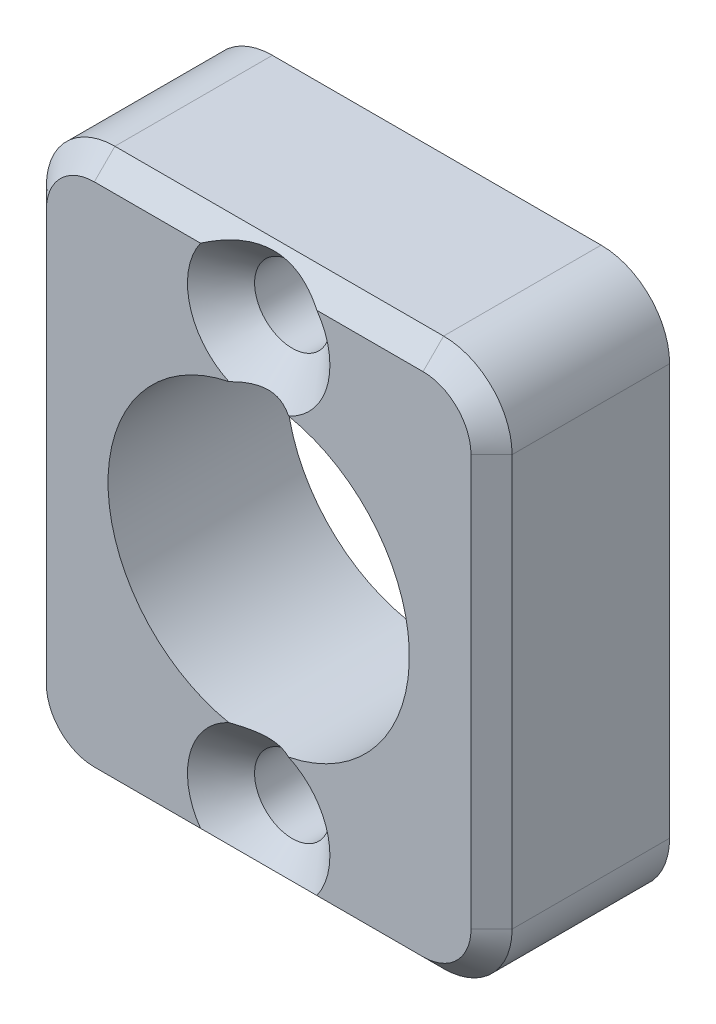
ISO-10303-21;
HEADER;
FILE_DESCRIPTION(('STEP AP214'),'2;1');
FILE_NAME('part.step','',(''),(''),'','','');
FILE_SCHEMA(('AUTOMOTIVE_DESIGN { 1 0 10303 214 1 1 1 1 }'));
ENDSEC;
DATA;
#1=APPLICATION_CONTEXT('core data for automotive mechanical design processes');
#2=APPLICATION_PROTOCOL_DEFINITION('international standard','automotive_design',2000,#1);
#3=PRODUCT_CONTEXT('',#1,'mechanical');
#4=PRODUCT('Part','Part','',(#3));
#5=PRODUCT_RELATED_PRODUCT_CATEGORY('part','',(#4));
#6=PRODUCT_DEFINITION_FORMATION('','',#4);
#7=PRODUCT_DEFINITION_CONTEXT('part definition',#1,'design');
#8=PRODUCT_DEFINITION('design','',#6,#7);
#9=PRODUCT_DEFINITION_SHAPE('','',#8);
#10=(LENGTH_UNIT() NAMED_UNIT(*) SI_UNIT(.MILLI.,.METRE.));
#11=(NAMED_UNIT(*) PLANE_ANGLE_UNIT() SI_UNIT($,.RADIAN.));
#12=(NAMED_UNIT(*) SI_UNIT($,.STERADIAN.) SOLID_ANGLE_UNIT());
#13=UNCERTAINTY_MEASURE_WITH_UNIT(LENGTH_MEASURE(1.E-05),#10,'distance_accuracy_value','');
#14=(GEOMETRIC_REPRESENTATION_CONTEXT(3) GLOBAL_UNCERTAINTY_ASSIGNED_CONTEXT((#13)) GLOBAL_UNIT_ASSIGNED_CONTEXT((#10,
#11,#12)) REPRESENTATION_CONTEXT('',''));
#15=CARTESIAN_POINT('',(0.,0.,0.));
#16=DIRECTION('',(0.,0.,1.));
#17=DIRECTION('',(1.,0.,0.));
#18=AXIS2_PLACEMENT_3D('',#15,#16,#17);
#19=CARTESIAN_POINT('',(0.,0.,0.));
#20=DIRECTION('',(0.,0.,1.));
#21=DIRECTION('',(1.,0.,0.));
#22=AXIS2_PLACEMENT_3D('',#19,#20,#21);
#23=PLANE('',#22);
#24=CARTESIAN_POINT('',(0.,15.5,0.));
#25=DIRECTION('',(0.,0.,1.));
#26=DIRECTION('',(1.,0.,0.));
#27=AXIS2_PLACEMENT_3D('',#24,#25,#26);
#28=CIRCLE('',#27,5.2);
#29=CARTESIAN_POINT('',(-4.24735211631906,18.5,0.));
#30=VERTEX_POINT('',#29);
#31=CARTESIAN_POINT('',(-2.1842011233736,10.7809677419355,0.));
#32=VERTEX_POINT('',#31);
#33=EDGE_CURVE('E159',#30,#32,#28,.T.);
#34=ORIENTED_EDGE('',*,*,#33,.F.);
#35=DIRECTION('',(-1.,0.,0.));
#36=VECTOR('',#35,1.);
#37=CARTESIAN_POINT('',(0.,18.5,0.));
#38=LINE('',#37,#36);
#39=CARTESIAN_POINT('',(-12.,18.5,0.));
#40=VERTEX_POINT('',#39);
#41=EDGE_CURVE('E397',#30,#40,#38,.T.);
#42=ORIENTED_EDGE('',*,*,#41,.T.);
#43=CARTESIAN_POINT('',(-12.,15.,0.));
#44=DIRECTION('',(0.,0.,1.));
#45=DIRECTION('',(1.,0.,0.));
#46=AXIS2_PLACEMENT_3D('',#43,#44,#45);
#47=CIRCLE('',#46,3.5);
#48=CARTESIAN_POINT('',(-15.5,15.,0.));
#49=VERTEX_POINT('',#48);
#50=EDGE_CURVE('E401',#40,#49,#47,.T.);
#51=ORIENTED_EDGE('',*,*,#50,.T.);
#52=DIRECTION('',(0.,-1.,0.));
#53=VECTOR('',#52,1.);
#54=CARTESIAN_POINT('',(-15.5,0.,0.));
#55=LINE('',#54,#53);
#56=CARTESIAN_POINT('',(-15.5,-15.,0.));
#57=VERTEX_POINT('',#56);
#58=EDGE_CURVE('E431',#49,#57,#55,.T.);
#59=ORIENTED_EDGE('',*,*,#58,.T.);
#60=CARTESIAN_POINT('',(-12.,-15.,0.));
#61=DIRECTION('',(0.,0.,1.));
#62=DIRECTION('',(1.,0.,0.));
#63=AXIS2_PLACEMENT_3D('',#60,#61,#62);
#64=CIRCLE('',#63,3.5);
#65=CARTESIAN_POINT('',(-12.,-18.5,0.));
#66=VERTEX_POINT('',#65);
#67=EDGE_CURVE('E398',#57,#66,#64,.T.);
#68=ORIENTED_EDGE('',*,*,#67,.T.);
#69=DIRECTION('',(1.,0.,0.));
#70=VECTOR('',#69,1.);
#71=CARTESIAN_POINT('',(0.,-18.5,0.));
#72=LINE('',#71,#70);
#73=CARTESIAN_POINT('',(-4.24735211631906,-18.5,0.));
#74=VERTEX_POINT('',#73);
#75=EDGE_CURVE('E396',#66,#74,#72,.T.);
#76=ORIENTED_EDGE('',*,*,#75,.T.);
#77=CARTESIAN_POINT('',(0.,-15.5,0.));
#78=DIRECTION('',(0.,0.,1.));
#79=DIRECTION('',(1.,0.,0.));
#80=AXIS2_PLACEMENT_3D('',#77,#78,#79);
#81=CIRCLE('',#80,5.2);
#82=CARTESIAN_POINT('',(-2.18420112337361,-10.7809677419355,0.));
#83=VERTEX_POINT('',#82);
#84=EDGE_CURVE('E387',#83,#74,#81,.T.);
#85=ORIENTED_EDGE('',*,*,#84,.F.);
#86=CARTESIAN_POINT('',(0.,0.,0.));
#87=DIRECTION('',(0.,0.,1.));
#88=DIRECTION('',(1.,0.,0.));
#89=AXIS2_PLACEMENT_3D('',#86,#87,#88);
#90=CIRCLE('',#89,11.);
#91=EDGE_CURVE('E180',#32,#83,#90,.T.);
#92=ORIENTED_EDGE('',*,*,#91,.F.);
#93=EDGE_LOOP('',(#34,#42,#51,#59,#68,#76,#85,#92));
#94=FACE_BOUND('',#93,.T.);
#95=ADVANCED_FACE('F37',(#94),#23,.T.);
#96=CARTESIAN_POINT('',(17.,20.,-13.));
#97=DIRECTION('',(1.,0.,0.));
#98=DIRECTION('',(0.,1.,0.));
#99=AXIS2_PLACEMENT_3D('',#96,#97,#98);
#100=PLANE('',#99);
#101=DIRECTION('',(0.,0.,1.));
#102=VECTOR('',#101,1.);
#103=CARTESIAN_POINT('',(17.,15.,-13.));
#104=LINE('',#103,#102);
#105=CARTESIAN_POINT('',(17.,15.,-13.));
#106=VERTEX_POINT('',#105);
#107=CARTESIAN_POINT('',(17.,15.,-1.50000000000001));
#108=VERTEX_POINT('',#107);
#109=EDGE_CURVE('E315',#106,#108,#104,.T.);
#110=ORIENTED_EDGE('',*,*,#109,.T.);
#111=DIRECTION('',(0.,-1.,0.));
#112=VECTOR('',#111,1.);
#113=CARTESIAN_POINT('',(17.,20.,-1.50000000000001));
#114=LINE('',#113,#112);
#115=CARTESIAN_POINT('',(17.,-15.,-1.50000000000001));
#116=VERTEX_POINT('',#115);
#117=EDGE_CURVE('E355',#108,#116,#114,.T.);
#118=ORIENTED_EDGE('',*,*,#117,.T.);
#119=DIRECTION('',(0.,0.,1.));
#120=VECTOR('',#119,1.);
#121=CARTESIAN_POINT('',(17.,-15.,-13.));
#122=LINE('',#121,#120);
#123=CARTESIAN_POINT('',(17.,-15.,-13.));
#124=VERTEX_POINT('',#123);
#125=EDGE_CURVE('E318',#116,#124,#122,.F.);
#126=ORIENTED_EDGE('',*,*,#125,.T.);
#127=DIRECTION('',(0.,1.,0.));
#128=VECTOR('',#127,1.);
#129=CARTESIAN_POINT('',(17.,20.,-13.));
#130=LINE('',#129,#128);
#131=EDGE_CURVE('E179',#124,#106,#130,.T.);
#132=ORIENTED_EDGE('',*,*,#131,.T.);
#133=EDGE_LOOP('',(#110,#118,#126,#132));
#134=FACE_BOUND('',#133,.T.);
#135=ADVANCED_FACE('F269',(#134),#100,.T.);
#136=CARTESIAN_POINT('',(-17.,-20.,-13.));
#137=DIRECTION('',(0.,-1.,0.));
#138=DIRECTION('',(0.,0.,-1.));
#139=AXIS2_PLACEMENT_3D('',#136,#137,#138);
#140=PLANE('',#139);
#141=DIRECTION('',(0.,0.,1.));
#142=VECTOR('',#141,1.);
#143=CARTESIAN_POINT('',(12.,-20.,-13.));
#144=LINE('',#143,#142);
#145=CARTESIAN_POINT('',(12.,-20.,-13.));
#146=VERTEX_POINT('',#145);
#147=CARTESIAN_POINT('',(12.,-20.,-1.50000000000001));
#148=VERTEX_POINT('',#147);
#149=EDGE_CURVE('E339',#146,#148,#144,.T.);
#150=ORIENTED_EDGE('',*,*,#149,.T.);
#151=DIRECTION('',(-1.,0.,0.));
#152=VECTOR('',#151,1.);
#153=CARTESIAN_POINT('',(-17.,-20.,-1.50000000000001));
#154=LINE('',#153,#152);
#155=CARTESIAN_POINT('',(-12.,-20.,-1.50000000000001));
#156=VERTEX_POINT('',#155);
#157=EDGE_CURVE('E233',#148,#156,#154,.T.);
#158=ORIENTED_EDGE('',*,*,#157,.T.);
#159=DIRECTION('',(0.,0.,1.));
#160=VECTOR('',#159,1.);
#161=CARTESIAN_POINT('',(-12.,-20.,-13.));
#162=LINE('',#161,#160);
#163=CARTESIAN_POINT('',(-12.,-20.,-13.));
#164=VERTEX_POINT('',#163);
#165=EDGE_CURVE('E313',#156,#164,#162,.F.);
#166=ORIENTED_EDGE('',*,*,#165,.T.);
#167=DIRECTION('',(1.,0.,0.));
#168=VECTOR('',#167,1.);
#169=CARTESIAN_POINT('',(-17.,-20.,-13.));
#170=LINE('',#169,#168);
#171=EDGE_CURVE('E197',#164,#146,#170,.T.);
#172=ORIENTED_EDGE('',*,*,#171,.T.);
#173=EDGE_LOOP('',(#150,#158,#166,#172));
#174=FACE_BOUND('',#173,.T.);
#175=ADVANCED_FACE('F275',(#174),#140,.T.);
#176=CARTESIAN_POINT('',(-17.,20.,-13.));
#177=DIRECTION('',(-1.,0.,0.));
#178=DIRECTION('',(0.,-1.,0.));
#179=AXIS2_PLACEMENT_3D('',#176,#177,#178);
#180=PLANE('',#179);
#181=DIRECTION('',(0.,0.,1.));
#182=VECTOR('',#181,1.);
#183=CARTESIAN_POINT('',(-17.,-15.,-13.));
#184=LINE('',#183,#182);
#185=CARTESIAN_POINT('',(-17.,-15.,-13.));
#186=VERTEX_POINT('',#185);
#187=CARTESIAN_POINT('',(-17.,-15.,-1.50000000000001));
#188=VERTEX_POINT('',#187);
#189=EDGE_CURVE('E314',#186,#188,#184,.T.);
#190=ORIENTED_EDGE('',*,*,#189,.T.);
#191=DIRECTION('',(0.,1.,0.));
#192=VECTOR('',#191,1.);
#193=CARTESIAN_POINT('',(-17.,20.,-1.50000000000001));
#194=LINE('',#193,#192);
#195=CARTESIAN_POINT('',(-17.,15.,-1.50000000000001));
#196=VERTEX_POINT('',#195);
#197=EDGE_CURVE('E11',#188,#196,#194,.T.);
#198=ORIENTED_EDGE('',*,*,#197,.T.);
#199=DIRECTION('',(0.,0.,1.));
#200=VECTOR('',#199,1.);
#201=CARTESIAN_POINT('',(-17.,15.,-13.));
#202=LINE('',#201,#200);
#203=CARTESIAN_POINT('',(-17.,15.,-13.));
#204=VERTEX_POINT('',#203);
#205=EDGE_CURVE('E163',#196,#204,#202,.F.);
#206=ORIENTED_EDGE('',*,*,#205,.T.);
#207=DIRECTION('',(0.,-1.,0.));
#208=VECTOR('',#207,1.);
#209=CARTESIAN_POINT('',(-17.,20.,-13.));
#210=LINE('',#209,#208);
#211=EDGE_CURVE('E194',#204,#186,#210,.T.);
#212=ORIENTED_EDGE('',*,*,#211,.T.);
#213=EDGE_LOOP('',(#190,#198,#206,#212));
#214=FACE_BOUND('',#213,.T.);
#215=ADVANCED_FACE('F290',(#214),#180,.T.);
#216=CARTESIAN_POINT('',(-17.,20.,-13.));
#217=DIRECTION('',(0.,1.,0.));
#218=DIRECTION('',(0.,0.,1.));
#219=AXIS2_PLACEMENT_3D('',#216,#217,#218);
#220=PLANE('',#219);
#221=DIRECTION('',(1.,0.,0.));
#222=VECTOR('',#221,1.);
#223=CARTESIAN_POINT('',(-17.,20.,-1.50000000000001));
#224=LINE('',#223,#222);
#225=CARTESIAN_POINT('',(-12.,20.,-1.50000000000001));
#226=VERTEX_POINT('',#225);
#227=CARTESIAN_POINT('',(12.,20.,-1.50000000000001));
#228=VERTEX_POINT('',#227);
#229=EDGE_CURVE('E366',#226,#228,#224,.T.);
#230=ORIENTED_EDGE('',*,*,#229,.T.);
#231=DIRECTION('',(0.,0.,1.));
#232=VECTOR('',#231,1.);
#233=CARTESIAN_POINT('',(12.,20.,-13.));
#234=LINE('',#233,#232);
#235=CARTESIAN_POINT('',(12.,20.,-13.));
#236=VERTEX_POINT('',#235);
#237=EDGE_CURVE('E325',#228,#236,#234,.F.);
#238=ORIENTED_EDGE('',*,*,#237,.T.);
#239=DIRECTION('',(-1.,0.,0.));
#240=VECTOR('',#239,1.);
#241=CARTESIAN_POINT('',(-17.,20.,-13.));
#242=LINE('',#241,#240);
#243=CARTESIAN_POINT('',(-12.,20.,-13.));
#244=VERTEX_POINT('',#243);
#245=EDGE_CURVE('E183',#236,#244,#242,.T.);
#246=ORIENTED_EDGE('',*,*,#245,.T.);
#247=DIRECTION('',(0.,0.,1.));
#248=VECTOR('',#247,1.);
#249=CARTESIAN_POINT('',(-12.,20.,-13.));
#250=LINE('',#249,#248);
#251=EDGE_CURVE('E327',#244,#226,#250,.T.);
#252=ORIENTED_EDGE('',*,*,#251,.T.);
#253=EDGE_LOOP('',(#230,#238,#246,#252));
#254=FACE_BOUND('',#253,.T.);
#255=ADVANCED_FACE('F285',(#254),#220,.T.);
#256=CARTESIAN_POINT('',(0.,0.,-13.));
#257=DIRECTION('',(0.,0.,1.));
#258=DIRECTION('',(1.,0.,0.));
#259=AXIS2_PLACEMENT_3D('',#256,#257,#258);
#260=PLANE('',#259);
#261=CARTESIAN_POINT('',(0.,15.5,-13.));
#262=DIRECTION('',(0.,0.,1.));
#263=DIRECTION('',(1.,0.,0.));
#264=AXIS2_PLACEMENT_3D('',#261,#262,#263);
#265=CIRCLE('',#264,2.75);
#266=CARTESIAN_POINT('',(2.75,15.5,-13.));
#267=VERTEX_POINT('',#266);
#268=EDGE_CURVE('E296',#267,#267,#265,.T.);
#269=ORIENTED_EDGE('',*,*,#268,.T.);
#270=EDGE_LOOP('',(#269));
#271=FACE_BOUND('',#270,.T.);
#272=CARTESIAN_POINT('',(0.,-15.5,-13.));
#273=DIRECTION('',(0.,0.,1.));
#274=DIRECTION('',(1.,0.,0.));
#275=AXIS2_PLACEMENT_3D('',#272,#273,#274);
#276=CIRCLE('',#275,2.75);
#277=CARTESIAN_POINT('',(2.75,-15.5,-13.));
#278=VERTEX_POINT('',#277);
#279=EDGE_CURVE('E188',#278,#278,#276,.T.);
#280=ORIENTED_EDGE('',*,*,#279,.T.);
#281=EDGE_LOOP('',(#280));
#282=FACE_BOUND('',#281,.T.);
#283=CARTESIAN_POINT('',(0.,0.,-13.));
#284=DIRECTION('',(0.,0.,1.));
#285=DIRECTION('',(1.,0.,0.));
#286=AXIS2_PLACEMENT_3D('',#283,#284,#285);
#287=CIRCLE('',#286,11.);
#288=CARTESIAN_POINT('',(11.,0.,-13.));
#289=VERTEX_POINT('',#288);
#290=EDGE_CURVE('E185',#289,#289,#287,.T.);
#291=ORIENTED_EDGE('',*,*,#290,.T.);
#292=EDGE_LOOP('',(#291));
#293=FACE_BOUND('',#292,.T.);
#294=ORIENTED_EDGE('',*,*,#171,.F.);
#295=CARTESIAN_POINT('',(-12.,-15.,-13.));
#296=DIRECTION('',(0.,0.,1.));
#297=DIRECTION('',(1.,0.,0.));
#298=AXIS2_PLACEMENT_3D('',#295,#296,#297);
#299=CIRCLE('',#298,5.);
#300=EDGE_CURVE('E305',#164,#186,#299,.F.);
#301=ORIENTED_EDGE('',*,*,#300,.T.);
#302=ORIENTED_EDGE('',*,*,#211,.F.);
#303=CARTESIAN_POINT('',(-12.,15.,-13.));
#304=DIRECTION('',(0.,0.,1.));
#305=DIRECTION('',(1.,0.,0.));
#306=AXIS2_PLACEMENT_3D('',#303,#304,#305);
#307=CIRCLE('',#306,5.);
#308=EDGE_CURVE('E320',#204,#244,#307,.F.);
#309=ORIENTED_EDGE('',*,*,#308,.T.);
#310=ORIENTED_EDGE('',*,*,#245,.F.);
#311=CARTESIAN_POINT('',(12.,15.,-13.));
#312=DIRECTION('',(0.,0.,1.));
#313=DIRECTION('',(1.,0.,0.));
#314=AXIS2_PLACEMENT_3D('',#311,#312,#313);
#315=CIRCLE('',#314,5.);
#316=EDGE_CURVE('E439',#236,#106,#315,.F.);
#317=ORIENTED_EDGE('',*,*,#316,.T.);
#318=ORIENTED_EDGE('',*,*,#131,.F.);
#319=CARTESIAN_POINT('',(12.,-15.,-13.));
#320=DIRECTION('',(0.,0.,1.));
#321=DIRECTION('',(1.,0.,0.));
#322=AXIS2_PLACEMENT_3D('',#319,#320,#321);
#323=CIRCLE('',#322,5.);
#324=EDGE_CURVE('E308',#124,#146,#323,.F.);
#325=ORIENTED_EDGE('',*,*,#324,.T.);
#326=EDGE_LOOP('',(#294,#301,#302,#309,#310,#317,#318,#325));
#327=FACE_BOUND('',#326,.T.);
#328=ADVANCED_FACE('F280',(#271,#282,#293,#327),#260,.F.);
#329=CARTESIAN_POINT('',(4.24735211631906,-18.5,0.));
#330=VERTEX_POINT('',#329);
#331=CARTESIAN_POINT('',(2.1842011233736,-10.7809677419355,0.));
#332=VERTEX_POINT('',#331);
#333=EDGE_CURVE('E384',#330,#332,#81,.T.);
#334=ORIENTED_EDGE('',*,*,#333,.F.);
#335=DIRECTION('',(1.,0.,0.));
#336=VECTOR('',#335,1.);
#337=CARTESIAN_POINT('',(0.,-18.5,0.));
#338=LINE('',#337,#336);
#339=CARTESIAN_POINT('',(12.,-18.5,0.));
#340=VERTEX_POINT('',#339);
#341=EDGE_CURVE('E336',#330,#340,#338,.T.);
#342=ORIENTED_EDGE('',*,*,#341,.T.);
#343=CARTESIAN_POINT('',(12.,-15.,0.));
#344=DIRECTION('',(0.,0.,1.));
#345=DIRECTION('',(1.,0.,0.));
#346=AXIS2_PLACEMENT_3D('',#343,#344,#345);
#347=CIRCLE('',#346,3.5);
#348=CARTESIAN_POINT('',(15.5,-15.,0.));
#349=VERTEX_POINT('',#348);
#350=EDGE_CURVE('E335',#340,#349,#347,.T.);
#351=ORIENTED_EDGE('',*,*,#350,.T.);
#352=DIRECTION('',(0.,1.,0.));
#353=VECTOR('',#352,1.);
#354=CARTESIAN_POINT('',(15.5,0.,0.));
#355=LINE('',#354,#353);
#356=CARTESIAN_POINT('',(15.5,15.,0.));
#357=VERTEX_POINT('',#356);
#358=EDGE_CURVE('E333',#349,#357,#355,.T.);
#359=ORIENTED_EDGE('',*,*,#358,.T.);
#360=CARTESIAN_POINT('',(12.,15.,0.));
#361=DIRECTION('',(0.,0.,1.));
#362=DIRECTION('',(1.,0.,0.));
#363=AXIS2_PLACEMENT_3D('',#360,#361,#362);
#364=CIRCLE('',#363,3.5);
#365=CARTESIAN_POINT('',(12.,18.5,0.));
#366=VERTEX_POINT('',#365);
#367=EDGE_CURVE('E331',#357,#366,#364,.T.);
#368=ORIENTED_EDGE('',*,*,#367,.T.);
#369=DIRECTION('',(-1.,0.,0.));
#370=VECTOR('',#369,1.);
#371=CARTESIAN_POINT('',(0.,18.5,0.));
#372=LINE('',#371,#370);
#373=CARTESIAN_POINT('',(4.24735211631906,18.5,0.));
#374=VERTEX_POINT('',#373);
#375=EDGE_CURVE('E173',#366,#374,#372,.T.);
#376=ORIENTED_EDGE('',*,*,#375,.T.);
#377=CARTESIAN_POINT('',(2.18420112337361,10.7809677419355,0.));
#378=VERTEX_POINT('',#377);
#379=EDGE_CURVE('E157',#378,#374,#28,.T.);
#380=ORIENTED_EDGE('',*,*,#379,.F.);
#381=EDGE_CURVE('E171',#332,#378,#90,.T.);
#382=ORIENTED_EDGE('',*,*,#381,.F.);
#383=EDGE_LOOP('',(#334,#342,#351,#359,#368,#376,#380,#382));
#384=FACE_BOUND('',#383,.T.);
#385=ADVANCED_FACE('F170',(#384),#23,.T.);
#386=CARTESIAN_POINT('',(0.,0.,0.));
#387=DIRECTION('',(0.,0.,-1.));
#388=DIRECTION('',(-1.,0.,0.));
#389=AXIS2_PLACEMENT_3D('',#386,#387,#388);
#390=CYLINDRICAL_SURFACE('',#389,11.);
#391=CARTESIAN_POINT('',(-2.1845322856352,10.780900643871,0.0002));
#392=CARTESIAN_POINT('',(-2.07688698378271,10.8027052659565,-0.0647649671110772));
#393=CARTESIAN_POINT('',(-1.96732579162165,10.8232342490427,-0.127200436944129));
#394=CARTESIAN_POINT('',(-1.74373042093198,10.8615083670385,-0.245538854118986));
#395=CARTESIAN_POINT('',(-1.62968074280338,10.8792425587361,-0.301415913866724));
#396=CARTESIAN_POINT('',(-1.39588052059917,10.9117184268738,-0.40526578278592));
#397=CARTESIAN_POINT('',(-1.27607768304642,10.9264212846011,-0.453134734896856));
#398=CARTESIAN_POINT('',(-1.03237128791027,10.9521313056623,-0.537840906173556));
#399=CARTESIAN_POINT('',(-0.908474297811111,10.9631440995612,-0.574694923352175));
#400=CARTESIAN_POINT('',(-0.69441134569456,10.97841789723,-0.626216194113996));
#401=CARTESIAN_POINT('',(-0.605119802738382,10.9837125540307,-0.644221759966512));
#402=CARTESIAN_POINT('',(-0.425254824249262,10.9921452933388,-0.673002592511588));
#403=CARTESIAN_POINT('',(-0.334681339662036,10.9952832930913,-0.683777581753747));
#404=CARTESIAN_POINT('',(-0.153532835705493,10.9992989337978,-0.69758050707933));
#405=CARTESIAN_POINT('',(-0.0629623241514119,11.0001923461084,-0.700662496218099));
#406=CARTESIAN_POINT('',(0.118102843056617,10.9997385520366,-0.699099489428168));
#407=CARTESIAN_POINT('',(0.208597500766026,10.9983914084701,-0.694454710125918));
#408=CARTESIAN_POINT('',(0.388602091094262,10.9935014772554,-0.677663971866978));
#409=CARTESIAN_POINT('',(0.478113868903255,10.9899639793248,-0.665536084901614));
#410=CARTESIAN_POINT('',(0.65581683862664,10.9807938856665,-0.634298401866646));
#411=CARTESIAN_POINT('',(0.744007433282871,10.9751603704687,-0.615185541730254));
#412=CARTESIAN_POINT('',(1.00693286340265,10.9552294899922,-0.548130133321352));
#413=CARTESIAN_POINT('',(1.1790288431421,10.9379309170347,-0.49057574416684));
#414=CARTESIAN_POINT('',(1.49367336891512,10.8991264221336,-0.364660156388223));
#415=CARTESIAN_POINT('',(1.63724624140929,10.8784039045993,-0.298511298848917));
#416=CARTESIAN_POINT('',(1.84695370210459,10.8440624951102,-0.19147473459993));
#417=CARTESIAN_POINT('',(1.91552831118483,10.8321515938974,-0.154731500364903));
#418=CARTESIAN_POINT('',(2.05114798312939,10.8072910787048,-0.0789243044380708));
#419=CARTESIAN_POINT('',(2.1181937724021,10.7943419718113,-0.0398614780838697));
#420=CARTESIAN_POINT('',(2.1845322856352,10.780900643871,0.000200000000001264));
#421=B_SPLINE_CURVE_WITH_KNOTS('',3,(#391,#392,#393,#394,#395,#396,#397,#398,#399,#400,#401,
#402,#403,#404,#405,#406,#407,#408,#409,#410,#411,#412,#413,#414,#415,#416,#417,#418,#419,#420),
.UNSPECIFIED.,.F.,.F.,(4,2,2,2,2,2,2,2,2,2,2,2,2,2,4),(0.,0.382940878257761,0.767345807541015,
1.156403476146,1.5448647600006,1.81830773553571,2.09176120297627,2.36328783609191,
2.63480685685837,2.90567270155748,3.17665750866033,3.72158912957937,4.19922460953715,
4.4352897281736,4.67124024083487),.UNSPECIFIED.);
#422=EDGE_CURVE('E153',#32,#378,#421,.T.);
#423=ORIENTED_EDGE('',*,*,#422,.F.);
#424=ORIENTED_EDGE('',*,*,#91,.T.);
#425=CARTESIAN_POINT('',(2.1845322856352,-10.780900643871,0.0002));
#426=CARTESIAN_POINT('',(2.07688698378271,-10.8027052659565,-0.0647649671110772));
#427=CARTESIAN_POINT('',(1.96732579162165,-10.8232342490427,-0.127200436944129));
#428=CARTESIAN_POINT('',(1.74373042093198,-10.8615083670385,-0.245538854118986));
#429=CARTESIAN_POINT('',(1.62968074280338,-10.8792425587361,-0.301415913866724));
#430=CARTESIAN_POINT('',(1.39588052059917,-10.9117184268738,-0.40526578278592));
#431=CARTESIAN_POINT('',(1.27607768304642,-10.9264212846011,-0.453134734896856));
#432=CARTESIAN_POINT('',(1.03237128791027,-10.9521313056623,-0.537840906173556));
#433=CARTESIAN_POINT('',(0.908474297811111,-10.9631440995612,-0.574694923352175));
#434=CARTESIAN_POINT('',(0.69441134569456,-10.97841789723,-0.626216194113996));
#435=CARTESIAN_POINT('',(0.605119802738382,-10.9837125540307,-0.644221759966512));
#436=CARTESIAN_POINT('',(0.425254824249262,-10.9921452933388,-0.673002592511588));
#437=CARTESIAN_POINT('',(0.334681339662036,-10.9952832930913,-0.683777581753747));
#438=CARTESIAN_POINT('',(0.153532835705493,-10.9992989337978,-0.69758050707933));
#439=CARTESIAN_POINT('',(0.0629623241514119,-11.0001923461084,-0.700662496218099));
#440=CARTESIAN_POINT('',(-0.118102843056617,-10.9997385520366,-0.699099489428168));
#441=CARTESIAN_POINT('',(-0.208597500766026,-10.9983914084701,-0.694454710125918));
#442=CARTESIAN_POINT('',(-0.388602091094262,-10.9935014772554,-0.677663971866978));
#443=CARTESIAN_POINT('',(-0.478113868903255,-10.9899639793248,-0.665536084901614));
#444=CARTESIAN_POINT('',(-0.65581683862664,-10.9807938856665,-0.634298401866646));
#445=CARTESIAN_POINT('',(-0.744007433282871,-10.9751603704687,-0.615185541730254));
#446=CARTESIAN_POINT('',(-1.00693286340265,-10.9552294899922,-0.548130133321352));
#447=CARTESIAN_POINT('',(-1.1790288431421,-10.9379309170347,-0.49057574416684));
#448=CARTESIAN_POINT('',(-1.49367336891512,-10.8991264221336,-0.364660156388223));
#449=CARTESIAN_POINT('',(-1.63724624140929,-10.8784039045993,-0.298511298848917));
#450=CARTESIAN_POINT('',(-1.84695370210459,-10.8440624951102,-0.19147473459993));
#451=CARTESIAN_POINT('',(-1.91552831118483,-10.8321515938974,-0.154731500364903));
#452=CARTESIAN_POINT('',(-2.05114798312939,-10.8072910787048,-0.0789243044380708));
#453=CARTESIAN_POINT('',(-2.1181937724021,-10.7943419718113,-0.0398614780838697));
#454=CARTESIAN_POINT('',(-2.1845322856352,-10.780900643871,0.000200000000001264));
#455=B_SPLINE_CURVE_WITH_KNOTS('',3,(#425,#426,#427,#428,#429,#430,#431,#432,#433,#434,#435,
#436,#437,#438,#439,#440,#441,#442,#443,#444,#445,#446,#447,#448,#449,#450,#451,#452,#453,#454),
.UNSPECIFIED.,.F.,.F.,(4,2,2,2,2,2,2,2,2,2,2,2,2,2,4),(0.,0.382940878257761,0.767345807541015,
1.156403476146,1.5448647600006,1.81830773553571,2.09176120297627,2.36328783609191,
2.63480685685837,2.90567270155748,3.17665750866033,3.72158912957937,4.19922460953715,
4.4352897281736,4.67124024083487),.UNSPECIFIED.);
#456=EDGE_CURVE('E164',#332,#83,#455,.T.);
#457=ORIENTED_EDGE('',*,*,#456,.F.);
#458=ORIENTED_EDGE('',*,*,#381,.T.);
#459=EDGE_LOOP('',(#423,#424,#457,#458));
#460=FACE_BOUND('',#459,.T.);
#461=ORIENTED_EDGE('',*,*,#290,.F.);
#462=EDGE_LOOP('',(#461));
#463=FACE_BOUND('',#462,.T.);
#464=ADVANCED_FACE('F176',(#460,#463),#390,.F.);
#465=CARTESIAN_POINT('',(0.,-15.5,0.));
#466=DIRECTION('',(0.,0.,1.));
#467=DIRECTION('',(1.,0.,0.));
#468=AXIS2_PLACEMENT_3D('',#465,#466,#467);
#469=CYLINDRICAL_SURFACE('',#468,2.75);
#470=ORIENTED_EDGE('',*,*,#279,.F.);
#471=EDGE_LOOP('',(#470));
#472=FACE_BOUND('',#471,.T.);
#473=CARTESIAN_POINT('',(0.,-15.5,-2.45));
#474=DIRECTION('',(0.,0.,1.));
#475=DIRECTION('',(1.,0.,0.));
#476=AXIS2_PLACEMENT_3D('',#473,#474,#475);
#477=CIRCLE('',#476,2.75);
#478=CARTESIAN_POINT('',(2.75,-15.5,-2.45));
#479=VERTEX_POINT('',#478);
#480=EDGE_CURVE('E388',#479,#479,#477,.T.);
#481=ORIENTED_EDGE('',*,*,#480,.T.);
#482=EDGE_LOOP('',(#481));
#483=FACE_BOUND('',#482,.T.);
#484=ADVANCED_FACE('F220',(#472,#483),#469,.F.);
#485=CARTESIAN_POINT('',(0.,-15.5,0.));
#486=DIRECTION('',(0.,0.,1.));
#487=DIRECTION('',(1.,0.,0.));
#488=AXIS2_PLACEMENT_3D('',#485,#486,#487);
#489=CONICAL_SURFACE('',#488,5.2,0.785398163397448);
#490=CARTESIAN_POINT('',(-4.24735211631906,-18.5,0.));
#491=CARTESIAN_POINT('',(-4.03972863518802,-18.6075135616361,-0.107513561636142));
#492=CARTESIAN_POINT('',(-3.82659516445979,-18.7100517421877,-0.210051742187745));
#493=CARTESIAN_POINT('',(-3.38831288573746,-18.9029087429309,-0.402908742930906));
#494=CARTESIAN_POINT('',(-3.16311607033833,-18.9931727604397,-0.493172760439692));
#495=CARTESIAN_POINT('',(-2.69960718872324,-19.1589149991051,-0.658914999105067));
#496=CARTESIAN_POINT('',(-2.46120239404471,-19.2342653446233,-0.734265344623278));
#497=CARTESIAN_POINT('',(-1.974410218202,-19.3658975029425,-0.865897502942487));
#498=CARTESIAN_POINT('',(-1.72604250366217,-19.4222149962355,-0.92221499623551));
#499=CARTESIAN_POINT('',(-1.31079156636374,-19.496856546832,-0.996856546832007));
#500=CARTESIAN_POINT('',(-1.14617695651084,-19.5215730025224,-1.02157300252242));
#501=CARTESIAN_POINT('',(-0.814565016921026,-19.5612163545177,-1.06121635451768));
#502=CARTESIAN_POINT('',(-0.647567571974882,-19.5761427758279,-1.07614277582791));
#503=CARTESIAN_POINT('',(-0.313387692331989,-19.595703747536,-1.09570374753598));
#504=CARTESIAN_POINT('',(-0.146212524276936,-19.6004001773393,-1.10040017733936));
#505=CARTESIAN_POINT('',(0.18808097403185,-19.5995463785471,-1.09954637854715));
#506=CARTESIAN_POINT('',(0.355199305934771,-19.5939964781876,-1.0939964781876));
#507=CARTESIAN_POINT('',(0.687929321028186,-19.5728292139692,-1.07282921396924));
#508=CARTESIAN_POINT('',(0.853542667208966,-19.557224823088,-1.05722482308805));
#509=CARTESIAN_POINT('',(1.18237265255715,-19.5164047138531,-1.01640471385311));
#510=CARTESIAN_POINT('',(1.34558917356417,-19.491188523291,-0.991188523291007));
#511=CARTESIAN_POINT('',(1.6696054369864,-19.4316347163346,-0.931634716334626));
#512=CARTESIAN_POINT('',(1.83038690601599,-19.3972476029557,-0.897247602955726));
#513=CARTESIAN_POINT('',(2.14789393288096,-19.3202304935483,-0.82023049354834));
#514=CARTESIAN_POINT('',(2.30461960952635,-19.2776007392897,-0.777600739289671));
#515=CARTESIAN_POINT('',(2.77850379445575,-19.1354763736464,-0.635476373646443));
#516=CARTESIAN_POINT('',(3.08850168919832,-19.0238232187372,-0.523823218737247));
#517=CARTESIAN_POINT('',(3.53628586074446,-18.8388261033339,-0.338826103333902));
#518=CARTESIAN_POINT('',(3.68196839410268,-18.7746174257442,-0.274617425744171));
#519=CARTESIAN_POINT('',(3.9683188331351,-18.6410260360733,-0.141026036073268));
#520=CARTESIAN_POINT('',(4.10899140336395,-18.5716483332067,-0.0716483332067488));
#521=CARTESIAN_POINT('',(4.24735211631906,-18.5,0.));
#522=B_SPLINE_CURVE_WITH_KNOTS('',3,(#490,#491,#492,#493,#494,#495,#496,#497,#498,#499,#500,
#501,#502,#503,#504,#505,#506,#507,#508,#509,#510,#511,#512,#513,#514,#515,#516,#517,#518,#519,
#520,#521),.UNSPECIFIED.,.F.,.F.,(4,2,2,2,2,2,2,2,2,2,2,2,2,2,2,4),(0.,0.772314281358432,
1.54797093791194,2.33001480912958,3.11058435926365,3.6149177286811,4.11927556562534,
4.62057405999057,5.12185649578879,5.62249343505756,6.12315497278096,6.62657535340385,
7.12998097014265,8.17026565639222,8.68510767223772,9.19945709525387),.UNSPECIFIED.);
#523=EDGE_CURVE('E224',#74,#330,#522,.T.);
#524=ORIENTED_EDGE('',*,*,#523,.T.);
#525=ORIENTED_EDGE('',*,*,#333,.T.);
#526=ORIENTED_EDGE('',*,*,#456,.T.);
#527=ORIENTED_EDGE('',*,*,#84,.T.);
#528=EDGE_LOOP('',(#524,#525,#526,#527));
#529=FACE_BOUND('',#528,.T.);
#530=ORIENTED_EDGE('',*,*,#480,.F.);
#531=EDGE_LOOP('',(#530));
#532=FACE_BOUND('',#531,.T.);
#533=ADVANCED_FACE('F215',(#529,#532),#489,.F.);
#534=CARTESIAN_POINT('',(0.,15.5,0.));
#535=DIRECTION('',(0.,0.,1.));
#536=DIRECTION('',(1.,0.,0.));
#537=AXIS2_PLACEMENT_3D('',#534,#535,#536);
#538=CYLINDRICAL_SURFACE('',#537,2.75);
#539=ORIENTED_EDGE('',*,*,#268,.F.);
#540=EDGE_LOOP('',(#539));
#541=FACE_BOUND('',#540,.T.);
#542=CARTESIAN_POINT('',(0.,15.5,-2.45));
#543=DIRECTION('',(0.,0.,1.));
#544=DIRECTION('',(1.,0.,0.));
#545=AXIS2_PLACEMENT_3D('',#542,#543,#544);
#546=CIRCLE('',#545,2.75);
#547=CARTESIAN_POINT('',(2.75,15.5,-2.45));
#548=VERTEX_POINT('',#547);
#549=EDGE_CURVE('E382',#548,#548,#546,.T.);
#550=ORIENTED_EDGE('',*,*,#549,.T.);
#551=EDGE_LOOP('',(#550));
#552=FACE_BOUND('',#551,.T.);
#553=ADVANCED_FACE('F219',(#541,#552),#538,.F.);
#554=CARTESIAN_POINT('',(0.,15.5,0.));
#555=DIRECTION('',(0.,0.,1.));
#556=DIRECTION('',(1.,0.,0.));
#557=AXIS2_PLACEMENT_3D('',#554,#555,#556);
#558=CONICAL_SURFACE('',#557,5.2,0.785398163397448);
#559=ORIENTED_EDGE('',*,*,#379,.T.);
#560=CARTESIAN_POINT('',(4.24735211631906,18.5,0.));
#561=CARTESIAN_POINT('',(4.03972863518802,18.6075135616361,-0.107513561636142));
#562=CARTESIAN_POINT('',(3.82659516445979,18.7100517421877,-0.210051742187745));
#563=CARTESIAN_POINT('',(3.38831288573746,18.9029087429309,-0.402908742930906));
#564=CARTESIAN_POINT('',(3.16311607033833,18.9931727604397,-0.493172760439692));
#565=CARTESIAN_POINT('',(2.69960718872324,19.1589149991051,-0.658914999105067));
#566=CARTESIAN_POINT('',(2.46120239404471,19.2342653446233,-0.734265344623278));
#567=CARTESIAN_POINT('',(1.974410218202,19.3658975029425,-0.865897502942487));
#568=CARTESIAN_POINT('',(1.72604250366217,19.4222149962355,-0.92221499623551));
#569=CARTESIAN_POINT('',(1.31079156636374,19.496856546832,-0.996856546832007));
#570=CARTESIAN_POINT('',(1.14617695651084,19.5215730025224,-1.02157300252242));
#571=CARTESIAN_POINT('',(0.814565016921026,19.5612163545177,-1.06121635451768));
#572=CARTESIAN_POINT('',(0.647567571974882,19.5761427758279,-1.07614277582791));
#573=CARTESIAN_POINT('',(0.313387692331989,19.595703747536,-1.09570374753598));
#574=CARTESIAN_POINT('',(0.146212524276936,19.6004001773393,-1.10040017733936));
#575=CARTESIAN_POINT('',(-0.18808097403185,19.5995463785471,-1.09954637854715));
#576=CARTESIAN_POINT('',(-0.355199305934771,19.5939964781876,-1.0939964781876));
#577=CARTESIAN_POINT('',(-0.687929321028186,19.5728292139692,-1.07282921396924));
#578=CARTESIAN_POINT('',(-0.853542667208966,19.557224823088,-1.05722482308805));
#579=CARTESIAN_POINT('',(-1.18237265255715,19.5164047138531,-1.01640471385311));
#580=CARTESIAN_POINT('',(-1.34558917356417,19.491188523291,-0.991188523291007));
#581=CARTESIAN_POINT('',(-1.6696054369864,19.4316347163346,-0.931634716334626));
#582=CARTESIAN_POINT('',(-1.83038690601599,19.3972476029557,-0.897247602955726));
#583=CARTESIAN_POINT('',(-2.14789393288096,19.3202304935483,-0.82023049354834));
#584=CARTESIAN_POINT('',(-2.30461960952635,19.2776007392897,-0.777600739289671));
#585=CARTESIAN_POINT('',(-2.77850379445575,19.1354763736464,-0.635476373646443));
#586=CARTESIAN_POINT('',(-3.08850168919832,19.0238232187372,-0.523823218737247));
#587=CARTESIAN_POINT('',(-3.53628586074446,18.8388261033339,-0.338826103333902));
#588=CARTESIAN_POINT('',(-3.68196839410268,18.7746174257442,-0.274617425744171));
#589=CARTESIAN_POINT('',(-3.9683188331351,18.6410260360733,-0.141026036073268));
#590=CARTESIAN_POINT('',(-4.10899140336395,18.5716483332067,-0.0716483332067488));
#591=CARTESIAN_POINT('',(-4.24735211631906,18.5,0.));
#592=B_SPLINE_CURVE_WITH_KNOTS('',3,(#560,#561,#562,#563,#564,#565,#566,#567,#568,#569,#570,
#571,#572,#573,#574,#575,#576,#577,#578,#579,#580,#581,#582,#583,#584,#585,#586,#587,#588,#589,
#590,#591),.UNSPECIFIED.,.F.,.F.,(4,2,2,2,2,2,2,2,2,2,2,2,2,2,2,4),(0.,0.772314281358432,
1.54797093791194,2.33001480912958,3.11058435926365,3.6149177286811,4.11927556562534,
4.62057405999057,5.12185649578879,5.62249343505756,6.12315497278096,6.62657535340385,
7.12998097014265,8.17026565639222,8.68510767223772,9.19945709525387),.UNSPECIFIED.);
#593=EDGE_CURVE('E358',#374,#30,#592,.T.);
#594=ORIENTED_EDGE('',*,*,#593,.T.);
#595=ORIENTED_EDGE('',*,*,#33,.T.);
#596=ORIENTED_EDGE('',*,*,#422,.T.);
#597=EDGE_LOOP('',(#559,#594,#595,#596));
#598=FACE_BOUND('',#597,.T.);
#599=ORIENTED_EDGE('',*,*,#549,.F.);
#600=EDGE_LOOP('',(#599));
#601=FACE_BOUND('',#600,.T.);
#602=ADVANCED_FACE('F155',(#598,#601),#558,.F.);
#603=CARTESIAN_POINT('',(-12.,-15.,-13.));
#604=DIRECTION('',(0.,0.,1.));
#605=DIRECTION('',(1.,0.,0.));
#606=AXIS2_PLACEMENT_3D('',#603,#604,#605);
#607=CYLINDRICAL_SURFACE('',#606,5.);
#608=ORIENTED_EDGE('',*,*,#165,.F.);
#609=CARTESIAN_POINT('',(-12.,-15.,-1.50000000000001));
#610=DIRECTION('',(0.,0.,1.));
#611=DIRECTION('',(1.,0.,0.));
#612=AXIS2_PLACEMENT_3D('',#609,#610,#611);
#613=CIRCLE('',#612,5.);
#614=EDGE_CURVE('E61',#156,#188,#613,.F.);
#615=ORIENTED_EDGE('',*,*,#614,.T.);
#616=ORIENTED_EDGE('',*,*,#189,.F.);
#617=ORIENTED_EDGE('',*,*,#300,.F.);
#618=EDGE_LOOP('',(#608,#615,#616,#617));
#619=FACE_BOUND('',#618,.T.);
#620=ADVANCED_FACE('F312',(#619),#607,.T.);
#621=CARTESIAN_POINT('',(12.,-15.,-13.));
#622=DIRECTION('',(0.,0.,1.));
#623=DIRECTION('',(1.,0.,0.));
#624=AXIS2_PLACEMENT_3D('',#621,#622,#623);
#625=CYLINDRICAL_SURFACE('',#624,5.);
#626=ORIENTED_EDGE('',*,*,#125,.F.);
#627=CARTESIAN_POINT('',(12.,-15.,-1.50000000000001));
#628=DIRECTION('',(0.,0.,1.));
#629=DIRECTION('',(1.,0.,0.));
#630=AXIS2_PLACEMENT_3D('',#627,#628,#629);
#631=CIRCLE('',#630,5.);
#632=EDGE_CURVE('E232',#116,#148,#631,.F.);
#633=ORIENTED_EDGE('',*,*,#632,.T.);
#634=ORIENTED_EDGE('',*,*,#149,.F.);
#635=ORIENTED_EDGE('',*,*,#324,.F.);
#636=EDGE_LOOP('',(#626,#633,#634,#635));
#637=FACE_BOUND('',#636,.T.);
#638=ADVANCED_FACE('F351',(#637),#625,.T.);
#639=CARTESIAN_POINT('',(-12.,15.,-13.));
#640=DIRECTION('',(0.,0.,1.));
#641=DIRECTION('',(1.,0.,0.));
#642=AXIS2_PLACEMENT_3D('',#639,#640,#641);
#643=CYLINDRICAL_SURFACE('',#642,5.);
#644=ORIENTED_EDGE('',*,*,#205,.F.);
#645=CARTESIAN_POINT('',(-12.,15.,-1.50000000000001));
#646=DIRECTION('',(0.,0.,1.));
#647=DIRECTION('',(1.,0.,0.));
#648=AXIS2_PLACEMENT_3D('',#645,#646,#647);
#649=CIRCLE('',#648,5.);
#650=EDGE_CURVE('E47',#196,#226,#649,.F.);
#651=ORIENTED_EDGE('',*,*,#650,.T.);
#652=ORIENTED_EDGE('',*,*,#251,.F.);
#653=ORIENTED_EDGE('',*,*,#308,.F.);
#654=EDGE_LOOP('',(#644,#651,#652,#653));
#655=FACE_BOUND('',#654,.T.);
#656=ADVANCED_FACE('F446',(#655),#643,.T.);
#657=CARTESIAN_POINT('',(12.,15.,-13.));
#658=DIRECTION('',(0.,0.,1.));
#659=DIRECTION('',(1.,0.,0.));
#660=AXIS2_PLACEMENT_3D('',#657,#658,#659);
#661=CYLINDRICAL_SURFACE('',#660,5.);
#662=ORIENTED_EDGE('',*,*,#237,.F.);
#663=CARTESIAN_POINT('',(12.,15.,-1.50000000000001));
#664=DIRECTION('',(0.,0.,1.));
#665=DIRECTION('',(1.,0.,0.));
#666=AXIS2_PLACEMENT_3D('',#663,#664,#665);
#667=CIRCLE('',#666,5.);
#668=EDGE_CURVE('E356',#228,#108,#667,.F.);
#669=ORIENTED_EDGE('',*,*,#668,.T.);
#670=ORIENTED_EDGE('',*,*,#109,.F.);
#671=ORIENTED_EDGE('',*,*,#316,.F.);
#672=EDGE_LOOP('',(#662,#669,#670,#671));
#673=FACE_BOUND('',#672,.T.);
#674=ADVANCED_FACE('F265',(#673),#661,.T.);
#675=CARTESIAN_POINT('',(0.,18.5,0.));
#676=DIRECTION('',(0.,-0.707106781186549,-0.707106781186546));
#677=DIRECTION('',(-1.,0.,0.));
#678=AXIS2_PLACEMENT_3D('',#675,#676,#677);
#679=PLANE('',#678);
#680=ORIENTED_EDGE('',*,*,#593,.F.);
#681=ORIENTED_EDGE('',*,*,#375,.F.);
#682=DIRECTION('',(0.,-0.707106781186546,0.707106781186549));
#683=VECTOR('',#682,1.);
#684=CARTESIAN_POINT('',(12.,20.,-1.50000000000001));
#685=LINE('',#684,#683);
#686=EDGE_CURVE('E417',#228,#366,#685,.T.);
#687=ORIENTED_EDGE('',*,*,#686,.F.);
#688=ORIENTED_EDGE('',*,*,#229,.F.);
#689=DIRECTION('',(0.,0.707106781186546,-0.707106781186549));
#690=VECTOR('',#689,1.);
#691=CARTESIAN_POINT('',(-12.,18.5,0.));
#692=LINE('',#691,#690);
#693=EDGE_CURVE('E42',#40,#226,#692,.T.);
#694=ORIENTED_EDGE('',*,*,#693,.F.);
#695=ORIENTED_EDGE('',*,*,#41,.F.);
#696=EDGE_LOOP('',(#680,#681,#687,#688,#694,#695));
#697=FACE_BOUND('',#696,.T.);
#698=ADVANCED_FACE('F39',(#697),#679,.F.);
#699=CARTESIAN_POINT('',(-12.,15.,0.));
#700=DIRECTION('',(0.,0.,-1.));
#701=DIRECTION('',(-1.,0.,0.));
#702=AXIS2_PLACEMENT_3D('',#699,#700,#701);
#703=CONICAL_SURFACE('',#702,3.5,0.785398163397446);
#704=ORIENTED_EDGE('',*,*,#693,.T.);
#705=ORIENTED_EDGE('',*,*,#650,.F.);
#706=DIRECTION('',(-0.707106781186546,0.,-0.707106781186549));
#707=VECTOR('',#706,1.);
#708=CARTESIAN_POINT('',(-15.5,15.,0.));
#709=LINE('',#708,#707);
#710=EDGE_CURVE('E419',#49,#196,#709,.T.);
#711=ORIENTED_EDGE('',*,*,#710,.F.);
#712=ORIENTED_EDGE('',*,*,#50,.F.);
#713=EDGE_LOOP('',(#704,#705,#711,#712));
#714=FACE_BOUND('',#713,.T.);
#715=ADVANCED_FACE('F258',(#714),#703,.T.);
#716=CARTESIAN_POINT('',(-15.5,0.,0.));
#717=DIRECTION('',(0.707106781186549,0.,-0.707106781186546));
#718=DIRECTION('',(0.,-1.,0.));
#719=AXIS2_PLACEMENT_3D('',#716,#717,#718);
#720=PLANE('',#719);
#721=ORIENTED_EDGE('',*,*,#710,.T.);
#722=ORIENTED_EDGE('',*,*,#197,.F.);
#723=DIRECTION('',(-0.707106781186546,0.,-0.707106781186549));
#724=VECTOR('',#723,1.);
#725=CARTESIAN_POINT('',(-15.5,-15.,0.));
#726=LINE('',#725,#724);
#727=EDGE_CURVE('E414',#57,#188,#726,.T.);
#728=ORIENTED_EDGE('',*,*,#727,.F.);
#729=ORIENTED_EDGE('',*,*,#58,.F.);
#730=EDGE_LOOP('',(#721,#722,#728,#729));
#731=FACE_BOUND('',#730,.T.);
#732=ADVANCED_FACE('F255',(#731),#720,.F.);
#733=CARTESIAN_POINT('',(12.,15.,0.));
#734=DIRECTION('',(0.,0.,-1.));
#735=DIRECTION('',(-1.,0.,0.));
#736=AXIS2_PLACEMENT_3D('',#733,#734,#735);
#737=CONICAL_SURFACE('',#736,3.5,0.785398163397446);
#738=ORIENTED_EDGE('',*,*,#686,.T.);
#739=ORIENTED_EDGE('',*,*,#367,.F.);
#740=DIRECTION('',(-0.707106781186546,0.,0.707106781186549));
#741=VECTOR('',#740,1.);
#742=CARTESIAN_POINT('',(17.,15.,-1.50000000000001));
#743=LINE('',#742,#741);
#744=EDGE_CURVE('E411',#108,#357,#743,.T.);
#745=ORIENTED_EDGE('',*,*,#744,.F.);
#746=ORIENTED_EDGE('',*,*,#668,.F.);
#747=EDGE_LOOP('',(#738,#739,#745,#746));
#748=FACE_BOUND('',#747,.T.);
#749=ADVANCED_FACE('F251',(#748),#737,.T.);
#750=CARTESIAN_POINT('',(-12.,-15.,0.));
#751=DIRECTION('',(0.,0.,-1.));
#752=DIRECTION('',(-1.,0.,0.));
#753=AXIS2_PLACEMENT_3D('',#750,#751,#752);
#754=CONICAL_SURFACE('',#753,3.5,0.785398163397446);
#755=ORIENTED_EDGE('',*,*,#727,.T.);
#756=ORIENTED_EDGE('',*,*,#614,.F.);
#757=DIRECTION('',(0.,-0.707106781186546,-0.707106781186549));
#758=VECTOR('',#757,1.);
#759=CARTESIAN_POINT('',(-12.,-18.5,0.));
#760=LINE('',#759,#758);
#761=EDGE_CURVE('E347',#66,#156,#760,.T.);
#762=ORIENTED_EDGE('',*,*,#761,.F.);
#763=ORIENTED_EDGE('',*,*,#67,.F.);
#764=EDGE_LOOP('',(#755,#756,#762,#763));
#765=FACE_BOUND('',#764,.T.);
#766=ADVANCED_FACE('F247',(#765),#754,.T.);
#767=CARTESIAN_POINT('',(15.5,0.,0.));
#768=DIRECTION('',(-0.707106781186549,0.,-0.707106781186546));
#769=DIRECTION('',(0.,1.,0.));
#770=AXIS2_PLACEMENT_3D('',#767,#768,#769);
#771=PLANE('',#770);
#772=ORIENTED_EDGE('',*,*,#744,.T.);
#773=ORIENTED_EDGE('',*,*,#358,.F.);
#774=DIRECTION('',(-0.707106781186546,0.,0.707106781186549));
#775=VECTOR('',#774,1.);
#776=CARTESIAN_POINT('',(17.,-15.,-1.50000000000001));
#777=LINE('',#776,#775);
#778=EDGE_CURVE('E408',#116,#349,#777,.T.);
#779=ORIENTED_EDGE('',*,*,#778,.F.);
#780=ORIENTED_EDGE('',*,*,#117,.F.);
#781=EDGE_LOOP('',(#772,#773,#779,#780));
#782=FACE_BOUND('',#781,.T.);
#783=ADVANCED_FACE('F242',(#782),#771,.F.);
#784=CARTESIAN_POINT('',(0.,-18.5,0.));
#785=DIRECTION('',(0.,0.707106781186549,-0.707106781186546));
#786=DIRECTION('',(1.,0.,0.));
#787=AXIS2_PLACEMENT_3D('',#784,#785,#786);
#788=PLANE('',#787);
#789=ORIENTED_EDGE('',*,*,#761,.T.);
#790=ORIENTED_EDGE('',*,*,#157,.F.);
#791=DIRECTION('',(0.,0.707106781186546,0.707106781186549));
#792=VECTOR('',#791,1.);
#793=CARTESIAN_POINT('',(12.,-20.,-1.50000000000001));
#794=LINE('',#793,#792);
#795=EDGE_CURVE('E343',#148,#340,#794,.T.);
#796=ORIENTED_EDGE('',*,*,#795,.T.);
#797=ORIENTED_EDGE('',*,*,#341,.F.);
#798=ORIENTED_EDGE('',*,*,#523,.F.);
#799=ORIENTED_EDGE('',*,*,#75,.F.);
#800=EDGE_LOOP('',(#789,#790,#796,#797,#798,#799));
#801=FACE_BOUND('',#800,.T.);
#802=ADVANCED_FACE('F236',(#801),#788,.F.);
#803=CARTESIAN_POINT('',(12.,-15.,0.));
#804=DIRECTION('',(0.,0.,-1.));
#805=DIRECTION('',(-1.,0.,0.));
#806=AXIS2_PLACEMENT_3D('',#803,#804,#805);
#807=CONICAL_SURFACE('',#806,3.5,0.785398163397446);
#808=ORIENTED_EDGE('',*,*,#778,.T.);
#809=ORIENTED_EDGE('',*,*,#350,.F.);
#810=ORIENTED_EDGE('',*,*,#795,.F.);
#811=ORIENTED_EDGE('',*,*,#632,.F.);
#812=EDGE_LOOP('',(#808,#809,#810,#811));
#813=FACE_BOUND('',#812,.T.);
#814=ADVANCED_FACE('F241',(#813),#807,.T.);
#815=CLOSED_SHELL('',(#95,#135,#175,#215,#255,#328,#385,#464,#484,#533,#553,#602,#620,#638,#656,
#674,#698,#715,#732,#749,#766,#783,#802,#814));
#816=MANIFOLD_SOLID_BREP('B2',#815);
#817=ADVANCED_BREP_SHAPE_REPRESENTATION('',(#18,#816),#14);
#818=SHAPE_DEFINITION_REPRESENTATION(#9,#817);
ENDSEC;
END-ISO-10303-21;
